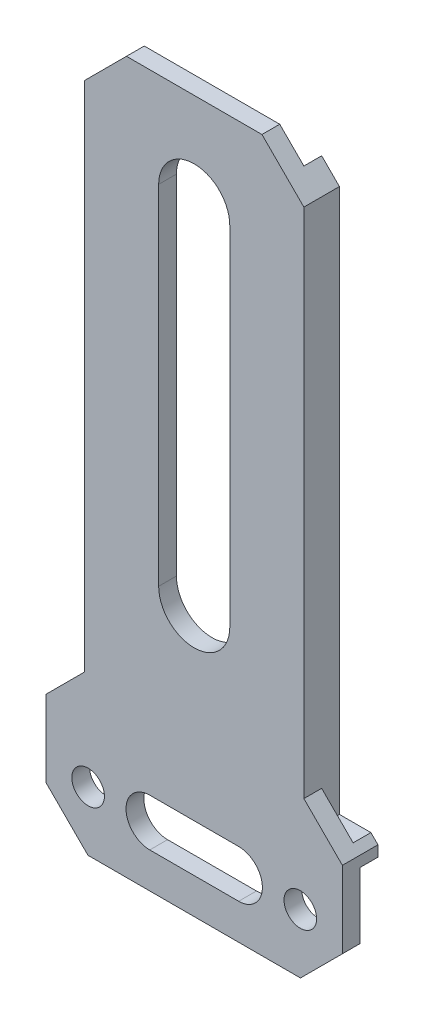
ISO-10303-21;
HEADER;
FILE_DESCRIPTION(('STEP AP214'),'2;1');
FILE_NAME('part.step','',(''),(''),'','','');
FILE_SCHEMA(('AUTOMOTIVE_DESIGN { 1 0 10303 214 1 1 1 1 }'));
ENDSEC;
DATA;
#1=APPLICATION_CONTEXT('core data for automotive mechanical design processes');
#2=APPLICATION_PROTOCOL_DEFINITION('international standard','automotive_design',2000,#1);
#3=PRODUCT_CONTEXT('',#1,'mechanical');
#4=PRODUCT('Part','Part','',(#3));
#5=PRODUCT_RELATED_PRODUCT_CATEGORY('part','',(#4));
#6=PRODUCT_DEFINITION_FORMATION('','',#4);
#7=PRODUCT_DEFINITION_CONTEXT('part definition',#1,'design');
#8=PRODUCT_DEFINITION('design','',#6,#7);
#9=PRODUCT_DEFINITION_SHAPE('','',#8);
#10=(LENGTH_UNIT() NAMED_UNIT(*) SI_UNIT(.MILLI.,.METRE.));
#11=(NAMED_UNIT(*) PLANE_ANGLE_UNIT() SI_UNIT($,.RADIAN.));
#12=(NAMED_UNIT(*) SI_UNIT($,.STERADIAN.) SOLID_ANGLE_UNIT());
#13=UNCERTAINTY_MEASURE_WITH_UNIT(LENGTH_MEASURE(1.E-05),#10,'distance_accuracy_value','');
#14=(GEOMETRIC_REPRESENTATION_CONTEXT(3) GLOBAL_UNCERTAINTY_ASSIGNED_CONTEXT((#13)) GLOBAL_UNIT_ASSIGNED_CONTEXT((#10,
#11,#12)) REPRESENTATION_CONTEXT('',''));
#15=CARTESIAN_POINT('',(0.,0.,0.));
#16=DIRECTION('',(0.,0.,1.));
#17=DIRECTION('',(1.,0.,0.));
#18=AXIS2_PLACEMENT_3D('',#15,#16,#17);
#19=CARTESIAN_POINT('',(0.,0.,0.));
#20=DIRECTION('',(0.,0.,1.));
#21=DIRECTION('',(1.,0.,0.));
#22=AXIS2_PLACEMENT_3D('',#19,#20,#21);
#23=PLANE('',#22);
#24=DIRECTION('',(1.,0.,0.));
#25=VECTOR('',#24,1.);
#26=CARTESIAN_POINT('',(48.81,21.19,0.));
#27=LINE('',#26,#25);
#28=CARTESIAN_POINT('',(43.5,21.19,0.));
#29=VERTEX_POINT('',#28);
#30=CARTESIAN_POINT('',(48.81,21.19,0.));
#31=VERTEX_POINT('',#30);
#32=EDGE_CURVE('E51',#29,#31,#27,.T.);
#33=ORIENTED_EDGE('',*,*,#32,.F.);
#34=DIRECTION('',(0.,-1.,0.));
#35=VECTOR('',#34,1.);
#36=CARTESIAN_POINT('',(43.5,112.928932188135,0.));
#37=LINE('',#36,#35);
#38=CARTESIAN_POINT('',(43.5,26.5,0.));
#39=VERTEX_POINT('',#38);
#40=EDGE_CURVE('E11',#39,#29,#37,.T.);
#41=ORIENTED_EDGE('',*,*,#40,.F.);
#42=DIRECTION('',(-0.707106781186547,0.707106781186548,0.));
#43=VECTOR('',#42,1.);
#44=CARTESIAN_POINT('',(43.5,26.5,0.));
#45=LINE('',#44,#43);
#46=EDGE_CURVE('E380',#31,#39,#45,.T.);
#47=ORIENTED_EDGE('',*,*,#46,.F.);
#48=EDGE_LOOP('',(#33,#41,#47));
#49=FACE_BOUND('',#48,.T.);
#50=ADVANCED_FACE('F35',(#49),#23,.F.);
#51=CARTESIAN_POINT('',(25.,45.27,0.));
#52=DIRECTION('',(0.,0.,1.));
#53=DIRECTION('',(1.,0.,0.));
#54=AXIS2_PLACEMENT_3D('',#51,#52,#53);
#55=CIRCLE('',#54,5.99999999999999);
#56=CARTESIAN_POINT('',(19.,45.27,0.));
#57=VERTEX_POINT('',#56);
#58=CARTESIAN_POINT('',(31.,45.27,0.));
#59=VERTEX_POINT('',#58);
#60=EDGE_CURVE('E305',#57,#59,#55,.T.);
#61=ORIENTED_EDGE('',*,*,#60,.T.);
#62=DIRECTION('',(0.,1.,0.));
#63=VECTOR('',#62,1.);
#64=CARTESIAN_POINT('',(31.,45.27,0.));
#65=LINE('',#64,#63);
#66=CARTESIAN_POINT('',(31.,104.,0.));
#67=VERTEX_POINT('',#66);
#68=EDGE_CURVE('E321',#59,#67,#65,.T.);
#69=ORIENTED_EDGE('',*,*,#68,.T.);
#70=CARTESIAN_POINT('',(25.,104.,0.));
#71=DIRECTION('',(0.,0.,1.));
#72=DIRECTION('',(1.,0.,0.));
#73=AXIS2_PLACEMENT_3D('',#70,#71,#72);
#74=CIRCLE('',#73,6.);
#75=CARTESIAN_POINT('',(19.,104.,0.));
#76=VERTEX_POINT('',#75);
#77=EDGE_CURVE('E324',#67,#76,#74,.T.);
#78=ORIENTED_EDGE('',*,*,#77,.T.);
#79=DIRECTION('',(0.,-1.,0.));
#80=VECTOR('',#79,1.);
#81=CARTESIAN_POINT('',(19.,45.27,0.));
#82=LINE('',#81,#80);
#83=EDGE_CURVE('E311',#76,#57,#82,.T.);
#84=ORIENTED_EDGE('',*,*,#83,.T.);
#85=EDGE_LOOP('',(#61,#69,#78,#84));
#86=FACE_BOUND('',#85,.T.);
#87=DIRECTION('',(0.,1.,0.));
#88=VECTOR('',#87,1.);
#89=CARTESIAN_POINT('',(40.5,115.928932188135,0.));
#90=LINE('',#89,#88);
#91=CARTESIAN_POINT('',(40.5,21.19,0.));
#92=VERTEX_POINT('',#91);
#93=CARTESIAN_POINT('',(40.5,115.928932188135,0.));
#94=VERTEX_POINT('',#93);
#95=EDGE_CURVE('E58',#92,#94,#90,.T.);
#96=ORIENTED_EDGE('',*,*,#95,.F.);
#97=DIRECTION('',(1.,0.,0.));
#98=VECTOR('',#97,1.);
#99=CARTESIAN_POINT('',(40.5,21.19,0.));
#100=LINE('',#99,#98);
#101=CARTESIAN_POINT('',(9.49999999999998,21.19,0.));
#102=VERTEX_POINT('',#101);
#103=EDGE_CURVE('E463',#102,#92,#100,.T.);
#104=ORIENTED_EDGE('',*,*,#103,.F.);
#105=DIRECTION('',(0.,-1.,0.));
#106=VECTOR('',#105,1.);
#107=CARTESIAN_POINT('',(9.49999999999999,115.928932188135,0.));
#108=LINE('',#107,#106);
#109=CARTESIAN_POINT('',(9.49999999999999,115.928932188135,0.));
#110=VERTEX_POINT('',#109);
#111=EDGE_CURVE('E460',#110,#102,#108,.T.);
#112=ORIENTED_EDGE('',*,*,#111,.F.);
#113=DIRECTION('',(-0.707106781186549,-0.707106781186546,0.));
#114=VECTOR('',#113,1.);
#115=CARTESIAN_POINT('',(13.5710678118655,120.,0.));
#116=LINE('',#115,#114);
#117=CARTESIAN_POINT('',(13.5710678118655,120.,0.));
#118=VERTEX_POINT('',#117);
#119=EDGE_CURVE('E338',#118,#110,#116,.T.);
#120=ORIENTED_EDGE('',*,*,#119,.F.);
#121=DIRECTION('',(-1.,0.,0.));
#122=VECTOR('',#121,1.);
#123=CARTESIAN_POINT('',(13.5710678118655,120.,0.));
#124=LINE('',#123,#122);
#125=CARTESIAN_POINT('',(36.4289321881345,120.,0.));
#126=VERTEX_POINT('',#125);
#127=EDGE_CURVE('E343',#126,#118,#124,.T.);
#128=ORIENTED_EDGE('',*,*,#127,.F.);
#129=DIRECTION('',(-0.707106781186549,0.707106781186546,0.));
#130=VECTOR('',#129,1.);
#131=CARTESIAN_POINT('',(36.4289321881345,120.,0.));
#132=LINE('',#131,#130);
#133=EDGE_CURVE('E383',#94,#126,#132,.T.);
#134=ORIENTED_EDGE('',*,*,#133,.F.);
#135=EDGE_LOOP('',(#96,#104,#112,#120,#128,#134));
#136=FACE_BOUND('',#135,.T.);
#137=ADVANCED_FACE('F503',(#86,#136),#23,.F.);
#138=DIRECTION('',(0.,1.,0.));
#139=VECTOR('',#138,1.);
#140=CARTESIAN_POINT('',(6.5,112.928932188135,0.));
#141=LINE('',#140,#139);
#142=CARTESIAN_POINT('',(6.5,21.19,0.));
#143=VERTEX_POINT('',#142);
#144=CARTESIAN_POINT('',(6.5,26.5,0.));
#145=VERTEX_POINT('',#144);
#146=EDGE_CURVE('E457',#143,#145,#141,.T.);
#147=ORIENTED_EDGE('',*,*,#146,.F.);
#148=DIRECTION('',(1.,0.,0.));
#149=VECTOR('',#148,1.);
#150=CARTESIAN_POINT('',(6.5,21.19,0.));
#151=LINE('',#150,#149);
#152=CARTESIAN_POINT('',(1.19,21.19,0.));
#153=VERTEX_POINT('',#152);
#154=EDGE_CURVE('E454',#153,#143,#151,.T.);
#155=ORIENTED_EDGE('',*,*,#154,.F.);
#156=DIRECTION('',(-0.707106781186549,-0.707106781186546,0.));
#157=VECTOR('',#156,1.);
#158=CARTESIAN_POINT('',(6.5,26.5,0.));
#159=LINE('',#158,#157);
#160=EDGE_CURVE('E368',#145,#153,#159,.T.);
#161=ORIENTED_EDGE('',*,*,#160,.F.);
#162=EDGE_LOOP('',(#147,#155,#161));
#163=FACE_BOUND('',#162,.T.);
#164=ADVANCED_FACE('F492',(#163),#23,.F.);
#165=CARTESIAN_POINT('',(17.5,10.,0.));
#166=DIRECTION('',(0.,0.,1.));
#167=DIRECTION('',(1.,0.,0.));
#168=AXIS2_PLACEMENT_3D('',#165,#166,#167);
#169=CIRCLE('',#168,4.);
#170=CARTESIAN_POINT('',(17.5,14.,0.));
#171=VERTEX_POINT('',#170);
#172=CARTESIAN_POINT('',(17.5,6.,0.));
#173=VERTEX_POINT('',#172);
#174=EDGE_CURVE('E259',#171,#173,#169,.T.);
#175=ORIENTED_EDGE('',*,*,#174,.T.);
#176=DIRECTION('',(1.,0.,0.));
#177=VECTOR('',#176,1.);
#178=CARTESIAN_POINT('',(17.5,6.,0.));
#179=LINE('',#178,#177);
#180=CARTESIAN_POINT('',(32.5,6.,0.));
#181=VERTEX_POINT('',#180);
#182=EDGE_CURVE('E262',#173,#181,#179,.T.);
#183=ORIENTED_EDGE('',*,*,#182,.T.);
#184=CARTESIAN_POINT('',(32.5,10.,0.));
#185=DIRECTION('',(0.,0.,1.));
#186=DIRECTION('',(1.,0.,0.));
#187=AXIS2_PLACEMENT_3D('',#184,#185,#186);
#188=CIRCLE('',#187,4.);
#189=CARTESIAN_POINT('',(32.5,14.,0.));
#190=VERTEX_POINT('',#189);
#191=EDGE_CURVE('E281',#181,#190,#188,.T.);
#192=ORIENTED_EDGE('',*,*,#191,.T.);
#193=DIRECTION('',(-1.,0.,0.));
#194=VECTOR('',#193,1.);
#195=CARTESIAN_POINT('',(17.5,14.,0.));
#196=LINE('',#195,#194);
#197=EDGE_CURVE('E271',#190,#171,#196,.T.);
#198=ORIENTED_EDGE('',*,*,#197,.T.);
#199=EDGE_LOOP('',(#175,#183,#192,#198));
#200=FACE_BOUND('',#199,.T.);
#201=CARTESIAN_POINT('',(7.09999999999999,9.99999999999999,0.));
#202=DIRECTION('',(0.,0.,1.));
#203=DIRECTION('',(1.,0.,0.));
#204=AXIS2_PLACEMENT_3D('',#201,#202,#203);
#205=CIRCLE('',#204,2.75);
#206=CARTESIAN_POINT('',(9.84999999999999,9.99999999999999,0.));
#207=VERTEX_POINT('',#206);
#208=EDGE_CURVE('E299',#207,#207,#205,.T.);
#209=ORIENTED_EDGE('',*,*,#208,.T.);
#210=EDGE_LOOP('',(#209));
#211=FACE_BOUND('',#210,.T.);
#212=CARTESIAN_POINT('',(42.9,9.99999999999999,0.));
#213=DIRECTION('',(0.,0.,1.));
#214=DIRECTION('',(-1.,0.,0.));
#215=AXIS2_PLACEMENT_3D('',#212,#213,#214);
#216=CIRCLE('',#215,2.74999999999999);
#217=CARTESIAN_POINT('',(40.15,9.99999999999999,0.));
#218=VERTEX_POINT('',#217);
#219=EDGE_CURVE('E295',#218,#218,#216,.T.);
#220=ORIENTED_EDGE('',*,*,#219,.T.);
#221=EDGE_LOOP('',(#220));
#222=FACE_BOUND('',#221,.T.);
#223=DIRECTION('',(-1.,0.,0.));
#224=VECTOR('',#223,1.);
#225=CARTESIAN_POINT('',(50.,18.19,0.));
#226=LINE('',#225,#224);
#227=CARTESIAN_POINT('',(50.,18.19,0.));
#228=VERTEX_POINT('',#227);
#229=CARTESIAN_POINT('',(0.,18.19,0.));
#230=VERTEX_POINT('',#229);
#231=EDGE_CURVE('E452',#228,#230,#226,.T.);
#232=ORIENTED_EDGE('',*,*,#231,.F.);
#233=DIRECTION('',(0.,1.,0.));
#234=VECTOR('',#233,1.);
#235=CARTESIAN_POINT('',(50.,7.07106781186551,0.));
#236=LINE('',#235,#234);
#237=CARTESIAN_POINT('',(50.,7.07106781186551,0.));
#238=VERTEX_POINT('',#237);
#239=EDGE_CURVE('E258',#238,#228,#236,.T.);
#240=ORIENTED_EDGE('',*,*,#239,.F.);
#241=DIRECTION('',(0.707106781186544,0.707106781186551,0.));
#242=VECTOR('',#241,1.);
#243=CARTESIAN_POINT('',(50.,7.07106781186551,0.));
#244=LINE('',#243,#242);
#245=CARTESIAN_POINT('',(42.9289321881345,0.,0.));
#246=VERTEX_POINT('',#245);
#247=EDGE_CURVE('E377',#246,#238,#244,.T.);
#248=ORIENTED_EDGE('',*,*,#247,.F.);
#249=DIRECTION('',(1.,0.,0.));
#250=VECTOR('',#249,1.);
#251=CARTESIAN_POINT('',(7.07106781186544,0.,0.));
#252=LINE('',#251,#250);
#253=CARTESIAN_POINT('',(7.07106781186544,0.,0.));
#254=VERTEX_POINT('',#253);
#255=EDGE_CURVE('E375',#254,#246,#252,.T.);
#256=ORIENTED_EDGE('',*,*,#255,.F.);
#257=DIRECTION('',(0.707106781186544,-0.707106781186551,0.));
#258=VECTOR('',#257,1.);
#259=CARTESIAN_POINT('',(0.,7.07106781186551,0.));
#260=LINE('',#259,#258);
#261=CARTESIAN_POINT('',(0.,7.07106781186551,0.));
#262=VERTEX_POINT('',#261);
#263=EDGE_CURVE('E373',#262,#254,#260,.T.);
#264=ORIENTED_EDGE('',*,*,#263,.F.);
#265=DIRECTION('',(0.,-1.,0.));
#266=VECTOR('',#265,1.);
#267=CARTESIAN_POINT('',(0.,7.07106781186551,0.));
#268=LINE('',#267,#266);
#269=EDGE_CURVE('E371',#230,#262,#268,.T.);
#270=ORIENTED_EDGE('',*,*,#269,.F.);
#271=EDGE_LOOP('',(#232,#240,#248,#256,#264,#270));
#272=FACE_BOUND('',#271,.T.);
#273=ADVANCED_FACE('F544',(#200,#211,#222,#272),#23,.F.);
#274=CARTESIAN_POINT('',(0.,0.,3.));
#275=DIRECTION('',(0.,0.,1.));
#276=DIRECTION('',(1.,0.,0.));
#277=AXIS2_PLACEMENT_3D('',#274,#275,#276);
#278=PLANE('',#277);
#279=CARTESIAN_POINT('',(7.09999999999999,9.99999999999999,3.));
#280=DIRECTION('',(0.,0.,1.));
#281=DIRECTION('',(1.,0.,0.));
#282=AXIS2_PLACEMENT_3D('',#279,#280,#281);
#283=CIRCLE('',#282,2.75);
#284=CARTESIAN_POINT('',(9.84999999999999,9.99999999999999,3.));
#285=VERTEX_POINT('',#284);
#286=EDGE_CURVE('E302',#285,#285,#283,.T.);
#287=ORIENTED_EDGE('',*,*,#286,.F.);
#288=EDGE_LOOP('',(#287));
#289=FACE_BOUND('',#288,.T.);
#290=DIRECTION('',(-0.707106781186549,-0.707106781186546,0.));
#291=VECTOR('',#290,1.);
#292=CARTESIAN_POINT('',(13.5710678118655,120.,3.));
#293=LINE('',#292,#291);
#294=CARTESIAN_POINT('',(13.5710678118655,120.,3.));
#295=VERTEX_POINT('',#294);
#296=CARTESIAN_POINT('',(6.5,112.928932188135,3.));
#297=VERTEX_POINT('',#296);
#298=EDGE_CURVE('E339',#295,#297,#293,.T.);
#299=ORIENTED_EDGE('',*,*,#298,.T.);
#300=DIRECTION('',(0.,-1.,0.));
#301=VECTOR('',#300,1.);
#302=CARTESIAN_POINT('',(6.5,112.928932188135,3.));
#303=LINE('',#302,#301);
#304=CARTESIAN_POINT('',(6.5,26.5,3.));
#305=VERTEX_POINT('',#304);
#306=EDGE_CURVE('E342',#297,#305,#303,.T.);
#307=ORIENTED_EDGE('',*,*,#306,.T.);
#308=DIRECTION('',(-0.707106781186549,-0.707106781186546,0.));
#309=VECTOR('',#308,1.);
#310=CARTESIAN_POINT('',(6.5,26.5,3.));
#311=LINE('',#310,#309);
#312=CARTESIAN_POINT('',(0.,20.,3.));
#313=VERTEX_POINT('',#312);
#314=EDGE_CURVE('E345',#305,#313,#311,.T.);
#315=ORIENTED_EDGE('',*,*,#314,.T.);
#316=DIRECTION('',(0.,-1.,0.));
#317=VECTOR('',#316,1.);
#318=CARTESIAN_POINT('',(0.,7.07106781186551,3.));
#319=LINE('',#318,#317);
#320=CARTESIAN_POINT('',(0.,7.07106781186551,3.));
#321=VERTEX_POINT('',#320);
#322=EDGE_CURVE('E347',#313,#321,#319,.T.);
#323=ORIENTED_EDGE('',*,*,#322,.T.);
#324=DIRECTION('',(0.707106781186544,-0.707106781186551,0.));
#325=VECTOR('',#324,1.);
#326=CARTESIAN_POINT('',(0.,7.07106781186551,3.));
#327=LINE('',#326,#325);
#328=CARTESIAN_POINT('',(7.07106781186544,0.,3.));
#329=VERTEX_POINT('',#328);
#330=EDGE_CURVE('E349',#321,#329,#327,.T.);
#331=ORIENTED_EDGE('',*,*,#330,.T.);
#332=DIRECTION('',(1.,0.,0.));
#333=VECTOR('',#332,1.);
#334=CARTESIAN_POINT('',(7.07106781186544,0.,3.));
#335=LINE('',#334,#333);
#336=CARTESIAN_POINT('',(42.9289321881345,0.,3.));
#337=VERTEX_POINT('',#336);
#338=EDGE_CURVE('E351',#329,#337,#335,.T.);
#339=ORIENTED_EDGE('',*,*,#338,.T.);
#340=DIRECTION('',(0.707106781186544,0.707106781186551,0.));
#341=VECTOR('',#340,1.);
#342=CARTESIAN_POINT('',(50.,7.07106781186551,3.));
#343=LINE('',#342,#341);
#344=CARTESIAN_POINT('',(50.,7.07106781186551,3.));
#345=VERTEX_POINT('',#344);
#346=EDGE_CURVE('E353',#337,#345,#343,.T.);
#347=ORIENTED_EDGE('',*,*,#346,.T.);
#348=DIRECTION('',(0.,1.,0.));
#349=VECTOR('',#348,1.);
#350=CARTESIAN_POINT('',(50.,7.07106781186551,3.));
#351=LINE('',#350,#349);
#352=CARTESIAN_POINT('',(50.,20.,3.));
#353=VERTEX_POINT('',#352);
#354=EDGE_CURVE('E355',#345,#353,#351,.T.);
#355=ORIENTED_EDGE('',*,*,#354,.T.);
#356=DIRECTION('',(-0.707106781186547,0.707106781186548,0.));
#357=VECTOR('',#356,1.);
#358=CARTESIAN_POINT('',(43.5,26.5,3.));
#359=LINE('',#358,#357);
#360=CARTESIAN_POINT('',(43.5,26.5,3.));
#361=VERTEX_POINT('',#360);
#362=EDGE_CURVE('E357',#353,#361,#359,.T.);
#363=ORIENTED_EDGE('',*,*,#362,.T.);
#364=DIRECTION('',(0.,1.,0.));
#365=VECTOR('',#364,1.);
#366=CARTESIAN_POINT('',(43.5,112.928932188135,3.));
#367=LINE('',#366,#365);
#368=CARTESIAN_POINT('',(43.5,112.928932188135,3.));
#369=VERTEX_POINT('',#368);
#370=EDGE_CURVE('E359',#361,#369,#367,.T.);
#371=ORIENTED_EDGE('',*,*,#370,.T.);
#372=DIRECTION('',(-0.707106781186549,0.707106781186546,0.));
#373=VECTOR('',#372,1.);
#374=CARTESIAN_POINT('',(36.4289321881345,120.,3.));
#375=LINE('',#374,#373);
#376=CARTESIAN_POINT('',(36.4289321881345,120.,3.));
#377=VERTEX_POINT('',#376);
#378=EDGE_CURVE('E361',#369,#377,#375,.T.);
#379=ORIENTED_EDGE('',*,*,#378,.T.);
#380=DIRECTION('',(-1.,0.,0.));
#381=VECTOR('',#380,1.);
#382=CARTESIAN_POINT('',(13.5710678118655,120.,3.));
#383=LINE('',#382,#381);
#384=EDGE_CURVE('E363',#377,#295,#383,.T.);
#385=ORIENTED_EDGE('',*,*,#384,.T.);
#386=EDGE_LOOP('',(#299,#307,#315,#323,#331,#339,#347,#355,#363,#371,#379,#385));
#387=FACE_BOUND('',#386,.T.);
#388=DIRECTION('',(0.,1.,0.));
#389=VECTOR('',#388,1.);
#390=CARTESIAN_POINT('',(31.,45.27,3.));
#391=LINE('',#390,#389);
#392=CARTESIAN_POINT('',(31.,45.27,3.));
#393=VERTEX_POINT('',#392);
#394=CARTESIAN_POINT('',(31.,104.,3.));
#395=VERTEX_POINT('',#394);
#396=EDGE_CURVE('E310',#393,#395,#391,.T.);
#397=ORIENTED_EDGE('',*,*,#396,.F.);
#398=CARTESIAN_POINT('',(25.,45.27,3.));
#399=DIRECTION('',(0.,0.,1.));
#400=DIRECTION('',(1.,0.,0.));
#401=AXIS2_PLACEMENT_3D('',#398,#399,#400);
#402=CIRCLE('',#401,5.99999999999999);
#403=CARTESIAN_POINT('',(19.,45.27,3.));
#404=VERTEX_POINT('',#403);
#405=EDGE_CURVE('E308',#404,#393,#402,.T.);
#406=ORIENTED_EDGE('',*,*,#405,.F.);
#407=DIRECTION('',(0.,-1.,0.));
#408=VECTOR('',#407,1.);
#409=CARTESIAN_POINT('',(19.,45.27,3.));
#410=LINE('',#409,#408);
#411=CARTESIAN_POINT('',(19.,104.,3.));
#412=VERTEX_POINT('',#411);
#413=EDGE_CURVE('E316',#412,#404,#410,.T.);
#414=ORIENTED_EDGE('',*,*,#413,.F.);
#415=CARTESIAN_POINT('',(25.,104.,3.));
#416=DIRECTION('',(0.,0.,1.));
#417=DIRECTION('',(1.,0.,0.));
#418=AXIS2_PLACEMENT_3D('',#415,#416,#417);
#419=CIRCLE('',#418,6.);
#420=EDGE_CURVE('E313',#395,#412,#419,.T.);
#421=ORIENTED_EDGE('',*,*,#420,.F.);
#422=EDGE_LOOP('',(#397,#406,#414,#421));
#423=FACE_BOUND('',#422,.T.);
#424=CARTESIAN_POINT('',(42.9,9.99999999999999,3.));
#425=DIRECTION('',(0.,0.,1.));
#426=DIRECTION('',(-1.,0.,0.));
#427=AXIS2_PLACEMENT_3D('',#424,#425,#426);
#428=CIRCLE('',#427,2.74999999999999);
#429=CARTESIAN_POINT('',(40.15,9.99999999999999,3.));
#430=VERTEX_POINT('',#429);
#431=EDGE_CURVE('E296',#430,#430,#428,.T.);
#432=ORIENTED_EDGE('',*,*,#431,.F.);
#433=EDGE_LOOP('',(#432));
#434=FACE_BOUND('',#433,.T.);
#435=DIRECTION('',(1.,0.,0.));
#436=VECTOR('',#435,1.);
#437=CARTESIAN_POINT('',(17.5,6.,3.));
#438=LINE('',#437,#436);
#439=CARTESIAN_POINT('',(17.5,6.,3.));
#440=VERTEX_POINT('',#439);
#441=CARTESIAN_POINT('',(32.5,6.,3.));
#442=VERTEX_POINT('',#441);
#443=EDGE_CURVE('E270',#440,#442,#438,.T.);
#444=ORIENTED_EDGE('',*,*,#443,.F.);
#445=CARTESIAN_POINT('',(17.5,10.,3.));
#446=DIRECTION('',(0.,0.,1.));
#447=DIRECTION('',(1.,0.,0.));
#448=AXIS2_PLACEMENT_3D('',#445,#446,#447);
#449=CIRCLE('',#448,4.);
#450=CARTESIAN_POINT('',(17.5,14.,3.));
#451=VERTEX_POINT('',#450);
#452=EDGE_CURVE('E268',#451,#440,#449,.T.);
#453=ORIENTED_EDGE('',*,*,#452,.F.);
#454=DIRECTION('',(-1.,0.,0.));
#455=VECTOR('',#454,1.);
#456=CARTESIAN_POINT('',(17.5,14.,3.));
#457=LINE('',#456,#455);
#458=CARTESIAN_POINT('',(32.5,14.,3.));
#459=VERTEX_POINT('',#458);
#460=EDGE_CURVE('E276',#459,#451,#457,.T.);
#461=ORIENTED_EDGE('',*,*,#460,.F.);
#462=CARTESIAN_POINT('',(32.5,10.,3.));
#463=DIRECTION('',(0.,0.,1.));
#464=DIRECTION('',(1.,0.,0.));
#465=AXIS2_PLACEMENT_3D('',#462,#463,#464);
#466=CIRCLE('',#465,4.);
#467=EDGE_CURVE('E273',#442,#459,#466,.T.);
#468=ORIENTED_EDGE('',*,*,#467,.F.);
#469=EDGE_LOOP('',(#444,#453,#461,#468));
#470=FACE_BOUND('',#469,.T.);
#471=ADVANCED_FACE('F495',(#289,#387,#423,#434,#470),#278,.T.);
#472=CARTESIAN_POINT('',(13.5710678118655,120.,3.));
#473=DIRECTION('',(0.707106781186546,-0.707106781186548,0.));
#474=DIRECTION('',(0.707106781186549,0.707106781186546,0.));
#475=AXIS2_PLACEMENT_3D('',#472,#473,#474);
#476=PLANE('',#475);
#477=ORIENTED_EDGE('',*,*,#119,.T.);
#478=DIRECTION('',(0.,0.,1.));
#479=VECTOR('',#478,1.);
#480=CARTESIAN_POINT('',(9.49999999999999,115.928932188135,-3.));
#481=LINE('',#480,#479);
#482=CARTESIAN_POINT('',(9.49999999999999,115.928932188135,-3.));
#483=VERTEX_POINT('',#482);
#484=EDGE_CURVE('E432',#483,#110,#481,.T.);
#485=ORIENTED_EDGE('',*,*,#484,.F.);
#486=DIRECTION('',(0.70710678118655,0.707106781186545,0.));
#487=VECTOR('',#486,1.);
#488=CARTESIAN_POINT('',(6.5,112.928932188135,-3.));
#489=LINE('',#488,#487);
#490=CARTESIAN_POINT('',(6.5,112.928932188135,-3.));
#491=VERTEX_POINT('',#490);
#492=EDGE_CURVE('E425',#491,#483,#489,.T.);
#493=ORIENTED_EDGE('',*,*,#492,.F.);
#494=DIRECTION('',(0.,0.,-1.));
#495=VECTOR('',#494,1.);
#496=CARTESIAN_POINT('',(6.5,112.928932188135,3.));
#497=LINE('',#496,#495);
#498=EDGE_CURVE('E39',#297,#491,#497,.T.);
#499=ORIENTED_EDGE('',*,*,#498,.F.);
#500=ORIENTED_EDGE('',*,*,#298,.F.);
#501=DIRECTION('',(0.,0.,-1.));
#502=VECTOR('',#501,1.);
#503=CARTESIAN_POINT('',(13.5710678118655,120.,3.));
#504=LINE('',#503,#502);
#505=EDGE_CURVE('E365',#295,#118,#504,.T.);
#506=ORIENTED_EDGE('',*,*,#505,.T.);
#507=EDGE_LOOP('',(#477,#485,#493,#499,#500,#506));
#508=FACE_BOUND('',#507,.T.);
#509=ADVANCED_FACE('F37',(#508),#476,.F.);
#510=CARTESIAN_POINT('',(6.5,112.928932188135,3.));
#511=DIRECTION('',(1.,0.,0.));
#512=DIRECTION('',(0.,1.,0.));
#513=AXIS2_PLACEMENT_3D('',#510,#511,#512);
#514=PLANE('',#513);
#515=ORIENTED_EDGE('',*,*,#498,.T.);
#516=DIRECTION('',(0.,1.,0.));
#517=VECTOR('',#516,1.);
#518=CARTESIAN_POINT('',(6.5,112.928932188135,-3.));
#519=LINE('',#518,#517);
#520=CARTESIAN_POINT('',(6.5,21.19,-3.));
#521=VERTEX_POINT('',#520);
#522=EDGE_CURVE('E421',#521,#491,#519,.T.);
#523=ORIENTED_EDGE('',*,*,#522,.F.);
#524=DIRECTION('',(0.,0.,1.));
#525=VECTOR('',#524,1.);
#526=CARTESIAN_POINT('',(6.5,21.19,-3.));
#527=LINE('',#526,#525);
#528=EDGE_CURVE('E482',#521,#143,#527,.T.);
#529=ORIENTED_EDGE('',*,*,#528,.T.);
#530=ORIENTED_EDGE('',*,*,#146,.T.);
#531=DIRECTION('',(0.,0.,-1.));
#532=VECTOR('',#531,1.);
#533=CARTESIAN_POINT('',(6.5,26.5,3.));
#534=LINE('',#533,#532);
#535=EDGE_CURVE('E410',#305,#145,#534,.T.);
#536=ORIENTED_EDGE('',*,*,#535,.F.);
#537=ORIENTED_EDGE('',*,*,#306,.F.);
#538=EDGE_LOOP('',(#515,#523,#529,#530,#536,#537));
#539=FACE_BOUND('',#538,.T.);
#540=ADVANCED_FACE('F419',(#539),#514,.F.);
#541=CARTESIAN_POINT('',(6.5,26.5,3.));
#542=DIRECTION('',(0.707106781186546,-0.707106781186548,0.));
#543=DIRECTION('',(0.707106781186549,0.707106781186546,0.));
#544=AXIS2_PLACEMENT_3D('',#541,#542,#543);
#545=PLANE('',#544);
#546=ORIENTED_EDGE('',*,*,#160,.T.);
#547=DIRECTION('',(0.,0.,1.));
#548=VECTOR('',#547,1.);
#549=CARTESIAN_POINT('',(1.19000000000003,21.19,-3.));
#550=LINE('',#549,#548);
#551=CARTESIAN_POINT('',(1.19000000000003,21.19,-3.));
#552=VERTEX_POINT('',#551);
#553=EDGE_CURVE('E264',#552,#153,#550,.T.);
#554=ORIENTED_EDGE('',*,*,#553,.F.);
#555=DIRECTION('',(0.707106781186558,0.707106781186537,0.));
#556=VECTOR('',#555,1.);
#557=CARTESIAN_POINT('',(1.19000000000003,21.19,-3.));
#558=LINE('',#557,#556);
#559=CARTESIAN_POINT('',(0.,20.,-3.));
#560=VERTEX_POINT('',#559);
#561=EDGE_CURVE('E490',#560,#552,#558,.T.);
#562=ORIENTED_EDGE('',*,*,#561,.F.);
#563=DIRECTION('',(0.,0.,-1.));
#564=VECTOR('',#563,1.);
#565=CARTESIAN_POINT('',(0.,20.,3.));
#566=LINE('',#565,#564);
#567=EDGE_CURVE('E409',#313,#560,#566,.T.);
#568=ORIENTED_EDGE('',*,*,#567,.F.);
#569=ORIENTED_EDGE('',*,*,#314,.F.);
#570=ORIENTED_EDGE('',*,*,#535,.T.);
#571=EDGE_LOOP('',(#546,#554,#562,#568,#569,#570));
#572=FACE_BOUND('',#571,.T.);
#573=ADVANCED_FACE('F488',(#572),#545,.F.);
#574=CARTESIAN_POINT('',(0.,7.07106781186551,3.));
#575=DIRECTION('',(1.,0.,0.));
#576=DIRECTION('',(0.,0.,-1.));
#577=AXIS2_PLACEMENT_3D('',#574,#575,#576);
#578=PLANE('',#577);
#579=ORIENTED_EDGE('',*,*,#567,.T.);
#580=DIRECTION('',(0.,1.,0.));
#581=VECTOR('',#580,1.);
#582=CARTESIAN_POINT('',(0.,20.,-3.));
#583=LINE('',#582,#581);
#584=CARTESIAN_POINT('',(0.,18.19,-3.));
#585=VERTEX_POINT('',#584);
#586=EDGE_CURVE('E243',#585,#560,#583,.T.);
#587=ORIENTED_EDGE('',*,*,#586,.F.);
#588=DIRECTION('',(0.,0.,1.));
#589=VECTOR('',#588,1.);
#590=CARTESIAN_POINT('',(0.,18.19,-3.));
#591=LINE('',#590,#589);
#592=EDGE_CURVE('E239',#585,#230,#591,.T.);
#593=ORIENTED_EDGE('',*,*,#592,.T.);
#594=ORIENTED_EDGE('',*,*,#269,.T.);
#595=DIRECTION('',(0.,0.,-1.));
#596=VECTOR('',#595,1.);
#597=CARTESIAN_POINT('',(0.,7.07106781186551,3.));
#598=LINE('',#597,#596);
#599=EDGE_CURVE('E406',#321,#262,#598,.T.);
#600=ORIENTED_EDGE('',*,*,#599,.F.);
#601=ORIENTED_EDGE('',*,*,#322,.F.);
#602=EDGE_LOOP('',(#579,#587,#593,#594,#600,#601));
#603=FACE_BOUND('',#602,.T.);
#604=ADVANCED_FACE('F547',(#603),#578,.F.);
#605=CARTESIAN_POINT('',(0.,7.07106781186551,3.));
#606=DIRECTION('',(0.707106781186551,0.707106781186544,0.));
#607=DIRECTION('',(-0.707106781186544,0.707106781186551,0.));
#608=AXIS2_PLACEMENT_3D('',#605,#606,#607);
#609=PLANE('',#608);
#610=ORIENTED_EDGE('',*,*,#263,.T.);
#611=DIRECTION('',(0.,0.,-1.));
#612=VECTOR('',#611,1.);
#613=CARTESIAN_POINT('',(7.07106781186544,0.,3.));
#614=LINE('',#613,#612);
#615=EDGE_CURVE('E403',#329,#254,#614,.T.);
#616=ORIENTED_EDGE('',*,*,#615,.F.);
#617=ORIENTED_EDGE('',*,*,#330,.F.);
#618=ORIENTED_EDGE('',*,*,#599,.T.);
#619=EDGE_LOOP('',(#610,#616,#617,#618));
#620=FACE_BOUND('',#619,.T.);
#621=ADVANCED_FACE('F553',(#620),#609,.F.);
#622=CARTESIAN_POINT('',(7.07106781186544,0.,3.));
#623=DIRECTION('',(0.,1.,0.));
#624=DIRECTION('',(0.,0.,1.));
#625=AXIS2_PLACEMENT_3D('',#622,#623,#624);
#626=PLANE('',#625);
#627=ORIENTED_EDGE('',*,*,#255,.T.);
#628=DIRECTION('',(0.,0.,-1.));
#629=VECTOR('',#628,1.);
#630=CARTESIAN_POINT('',(42.9289321881345,0.,3.));
#631=LINE('',#630,#629);
#632=EDGE_CURVE('E400',#337,#246,#631,.T.);
#633=ORIENTED_EDGE('',*,*,#632,.F.);
#634=ORIENTED_EDGE('',*,*,#338,.F.);
#635=ORIENTED_EDGE('',*,*,#615,.T.);
#636=EDGE_LOOP('',(#627,#633,#634,#635));
#637=FACE_BOUND('',#636,.T.);
#638=ADVANCED_FACE('F555',(#637),#626,.F.);
#639=CARTESIAN_POINT('',(50.,7.07106781186551,3.));
#640=DIRECTION('',(-0.707106781186551,0.707106781186544,0.));
#641=DIRECTION('',(-0.707106781186544,-0.707106781186551,0.));
#642=AXIS2_PLACEMENT_3D('',#639,#640,#641);
#643=PLANE('',#642);
#644=ORIENTED_EDGE('',*,*,#247,.T.);
#645=DIRECTION('',(0.,0.,-1.));
#646=VECTOR('',#645,1.);
#647=CARTESIAN_POINT('',(50.,7.07106781186551,3.));
#648=LINE('',#647,#646);
#649=EDGE_CURVE('E398',#345,#238,#648,.T.);
#650=ORIENTED_EDGE('',*,*,#649,.F.);
#651=ORIENTED_EDGE('',*,*,#346,.F.);
#652=ORIENTED_EDGE('',*,*,#632,.T.);
#653=EDGE_LOOP('',(#644,#650,#651,#652));
#654=FACE_BOUND('',#653,.T.);
#655=ADVANCED_FACE('F540',(#654),#643,.F.);
#656=CARTESIAN_POINT('',(50.,7.07106781186551,3.));
#657=DIRECTION('',(-1.,0.,0.));
#658=DIRECTION('',(0.,0.,1.));
#659=AXIS2_PLACEMENT_3D('',#656,#657,#658);
#660=PLANE('',#659);
#661=ORIENTED_EDGE('',*,*,#239,.T.);
#662=DIRECTION('',(0.,0.,1.));
#663=VECTOR('',#662,1.);
#664=CARTESIAN_POINT('',(50.,18.19,-3.));
#665=LINE('',#664,#663);
#666=CARTESIAN_POINT('',(50.,18.19,-3.));
#667=VERTEX_POINT('',#666);
#668=EDGE_CURVE('E237',#667,#228,#665,.T.);
#669=ORIENTED_EDGE('',*,*,#668,.F.);
#670=DIRECTION('',(0.,-1.,0.));
#671=VECTOR('',#670,1.);
#672=CARTESIAN_POINT('',(50.,20.,-3.));
#673=LINE('',#672,#671);
#674=CARTESIAN_POINT('',(50.,20.,-3.));
#675=VERTEX_POINT('',#674);
#676=EDGE_CURVE('E244',#675,#667,#673,.T.);
#677=ORIENTED_EDGE('',*,*,#676,.F.);
#678=DIRECTION('',(0.,0.,-1.));
#679=VECTOR('',#678,1.);
#680=CARTESIAN_POINT('',(50.,20.,3.));
#681=LINE('',#680,#679);
#682=EDGE_CURVE('E396',#353,#675,#681,.T.);
#683=ORIENTED_EDGE('',*,*,#682,.F.);
#684=ORIENTED_EDGE('',*,*,#354,.F.);
#685=ORIENTED_EDGE('',*,*,#649,.T.);
#686=EDGE_LOOP('',(#661,#669,#677,#683,#684,#685));
#687=FACE_BOUND('',#686,.T.);
#688=ADVANCED_FACE('F255',(#687),#660,.F.);
#689=CARTESIAN_POINT('',(43.5,26.5,3.));
#690=DIRECTION('',(-0.707106781186548,-0.707106781186547,0.));
#691=DIRECTION('',(0.707106781186547,-0.707106781186548,0.));
#692=AXIS2_PLACEMENT_3D('',#689,#690,#691);
#693=PLANE('',#692);
#694=ORIENTED_EDGE('',*,*,#682,.T.);
#695=DIRECTION('',(0.707106781186548,-0.707106781186546,0.));
#696=VECTOR('',#695,1.);
#697=CARTESIAN_POINT('',(48.81,21.19,-3.));
#698=LINE('',#697,#696);
#699=CARTESIAN_POINT('',(48.81,21.19,-3.));
#700=VERTEX_POINT('',#699);
#701=EDGE_CURVE('E250',#700,#675,#698,.T.);
#702=ORIENTED_EDGE('',*,*,#701,.F.);
#703=DIRECTION('',(0.,0.,1.));
#704=VECTOR('',#703,1.);
#705=CARTESIAN_POINT('',(48.81,21.19,-3.));
#706=LINE('',#705,#704);
#707=EDGE_CURVE('E451',#700,#31,#706,.T.);
#708=ORIENTED_EDGE('',*,*,#707,.T.);
#709=ORIENTED_EDGE('',*,*,#46,.T.);
#710=DIRECTION('',(0.,0.,-1.));
#711=VECTOR('',#710,1.);
#712=CARTESIAN_POINT('',(43.5,26.5,3.));
#713=LINE('',#712,#711);
#714=EDGE_CURVE('E393',#361,#39,#713,.T.);
#715=ORIENTED_EDGE('',*,*,#714,.F.);
#716=ORIENTED_EDGE('',*,*,#362,.F.);
#717=EDGE_LOOP('',(#694,#702,#708,#709,#715,#716));
#718=FACE_BOUND('',#717,.T.);
#719=ADVANCED_FACE('F531',(#718),#693,.F.);
#720=CARTESIAN_POINT('',(43.5,112.928932188135,3.));
#721=DIRECTION('',(-1.,0.,0.));
#722=DIRECTION('',(0.,0.,1.));
#723=AXIS2_PLACEMENT_3D('',#720,#721,#722);
#724=PLANE('',#723);
#725=ORIENTED_EDGE('',*,*,#714,.T.);
#726=ORIENTED_EDGE('',*,*,#40,.T.);
#727=DIRECTION('',(0.,0.,1.));
#728=VECTOR('',#727,1.);
#729=CARTESIAN_POINT('',(43.5,21.19,-3.));
#730=LINE('',#729,#728);
#731=CARTESIAN_POINT('',(43.5,21.19,-3.));
#732=VERTEX_POINT('',#731);
#733=EDGE_CURVE('E469',#732,#29,#730,.T.);
#734=ORIENTED_EDGE('',*,*,#733,.F.);
#735=DIRECTION('',(0.,-1.,0.));
#736=VECTOR('',#735,1.);
#737=CARTESIAN_POINT('',(43.5,112.928932188135,-3.));
#738=LINE('',#737,#736);
#739=CARTESIAN_POINT('',(43.5,112.928932188135,-3.));
#740=VERTEX_POINT('',#739);
#741=EDGE_CURVE('E446',#740,#732,#738,.T.);
#742=ORIENTED_EDGE('',*,*,#741,.F.);
#743=DIRECTION('',(0.,0.,-1.));
#744=VECTOR('',#743,1.);
#745=CARTESIAN_POINT('',(43.5,112.928932188135,3.));
#746=LINE('',#745,#744);
#747=EDGE_CURVE('E391',#369,#740,#746,.T.);
#748=ORIENTED_EDGE('',*,*,#747,.F.);
#749=ORIENTED_EDGE('',*,*,#370,.F.);
#750=EDGE_LOOP('',(#725,#726,#734,#742,#748,#749));
#751=FACE_BOUND('',#750,.T.);
#752=ADVANCED_FACE('F524',(#751),#724,.F.);
#753=CARTESIAN_POINT('',(36.4289321881345,120.,3.));
#754=DIRECTION('',(-0.707106781186546,-0.707106781186549,0.));
#755=DIRECTION('',(0.707106781186549,-0.707106781186546,0.));
#756=AXIS2_PLACEMENT_3D('',#753,#754,#755);
#757=PLANE('',#756);
#758=ORIENTED_EDGE('',*,*,#747,.T.);
#759=DIRECTION('',(0.707106781186547,-0.707106781186547,0.));
#760=VECTOR('',#759,1.);
#761=CARTESIAN_POINT('',(40.5,115.928932188135,-3.));
#762=LINE('',#761,#760);
#763=CARTESIAN_POINT('',(40.5,115.928932188135,-3.));
#764=VERTEX_POINT('',#763);
#765=EDGE_CURVE('E443',#764,#740,#762,.T.);
#766=ORIENTED_EDGE('',*,*,#765,.F.);
#767=DIRECTION('',(0.,0.,1.));
#768=VECTOR('',#767,1.);
#769=CARTESIAN_POINT('',(40.5,115.928932188135,-3.));
#770=LINE('',#769,#768);
#771=EDGE_CURVE('E472',#764,#94,#770,.T.);
#772=ORIENTED_EDGE('',*,*,#771,.T.);
#773=ORIENTED_EDGE('',*,*,#133,.T.);
#774=DIRECTION('',(0.,0.,-1.));
#775=VECTOR('',#774,1.);
#776=CARTESIAN_POINT('',(36.4289321881345,120.,3.));
#777=LINE('',#776,#775);
#778=EDGE_CURVE('E388',#377,#126,#777,.T.);
#779=ORIENTED_EDGE('',*,*,#778,.F.);
#780=ORIENTED_EDGE('',*,*,#378,.F.);
#781=EDGE_LOOP('',(#758,#766,#772,#773,#779,#780));
#782=FACE_BOUND('',#781,.T.);
#783=ADVANCED_FACE('F518',(#782),#757,.F.);
#784=CARTESIAN_POINT('',(13.5710678118655,120.,3.));
#785=DIRECTION('',(0.,-1.,0.));
#786=DIRECTION('',(0.,0.,-1.));
#787=AXIS2_PLACEMENT_3D('',#784,#785,#786);
#788=PLANE('',#787);
#789=ORIENTED_EDGE('',*,*,#127,.T.);
#790=ORIENTED_EDGE('',*,*,#505,.F.);
#791=ORIENTED_EDGE('',*,*,#384,.F.);
#792=ORIENTED_EDGE('',*,*,#778,.T.);
#793=EDGE_LOOP('',(#789,#790,#791,#792));
#794=FACE_BOUND('',#793,.T.);
#795=ADVANCED_FACE('F615',(#794),#788,.F.);
#796=CARTESIAN_POINT('',(25.,45.27,3.));
#797=DIRECTION('',(0.,0.,-1.));
#798=DIRECTION('',(-1.,0.,0.));
#799=AXIS2_PLACEMENT_3D('',#796,#797,#798);
#800=CYLINDRICAL_SURFACE('',#799,5.99999999999999);
#801=ORIENTED_EDGE('',*,*,#60,.F.);
#802=DIRECTION('',(0.,0.,-1.));
#803=VECTOR('',#802,1.);
#804=CARTESIAN_POINT('',(19.,45.27,3.));
#805=LINE('',#804,#803);
#806=EDGE_CURVE('E318',#404,#57,#805,.T.);
#807=ORIENTED_EDGE('',*,*,#806,.F.);
#808=ORIENTED_EDGE('',*,*,#405,.T.);
#809=DIRECTION('',(0.,0.,-1.));
#810=VECTOR('',#809,1.);
#811=CARTESIAN_POINT('',(31.,45.27,3.));
#812=LINE('',#811,#810);
#813=EDGE_CURVE('E335',#393,#59,#812,.T.);
#814=ORIENTED_EDGE('',*,*,#813,.T.);
#815=EDGE_LOOP('',(#801,#807,#808,#814));
#816=FACE_BOUND('',#815,.T.);
#817=ADVANCED_FACE('F612',(#816),#800,.F.);
#818=CARTESIAN_POINT('',(31.,45.27,3.));
#819=DIRECTION('',(-1.,0.,0.));
#820=DIRECTION('',(0.,-1.,0.));
#821=AXIS2_PLACEMENT_3D('',#818,#819,#820);
#822=PLANE('',#821);
#823=ORIENTED_EDGE('',*,*,#68,.F.);
#824=ORIENTED_EDGE('',*,*,#813,.F.);
#825=ORIENTED_EDGE('',*,*,#396,.T.);
#826=DIRECTION('',(0.,0.,-1.));
#827=VECTOR('',#826,1.);
#828=CARTESIAN_POINT('',(31.,104.,3.));
#829=LINE('',#828,#827);
#830=EDGE_CURVE('E333',#395,#67,#829,.T.);
#831=ORIENTED_EDGE('',*,*,#830,.T.);
#832=EDGE_LOOP('',(#823,#824,#825,#831));
#833=FACE_BOUND('',#832,.T.);
#834=ADVANCED_FACE('F608',(#833),#822,.T.);
#835=CARTESIAN_POINT('',(25.,104.,3.));
#836=DIRECTION('',(0.,0.,-1.));
#837=DIRECTION('',(-1.,0.,0.));
#838=AXIS2_PLACEMENT_3D('',#835,#836,#837);
#839=CYLINDRICAL_SURFACE('',#838,6.);
#840=ORIENTED_EDGE('',*,*,#77,.F.);
#841=ORIENTED_EDGE('',*,*,#830,.F.);
#842=ORIENTED_EDGE('',*,*,#420,.T.);
#843=DIRECTION('',(0.,0.,-1.));
#844=VECTOR('',#843,1.);
#845=CARTESIAN_POINT('',(19.,104.,3.));
#846=LINE('',#845,#844);
#847=EDGE_CURVE('E331',#412,#76,#846,.T.);
#848=ORIENTED_EDGE('',*,*,#847,.T.);
#849=EDGE_LOOP('',(#840,#841,#842,#848));
#850=FACE_BOUND('',#849,.T.);
#851=ADVANCED_FACE('F604',(#850),#839,.F.);
#852=CARTESIAN_POINT('',(19.,45.27,3.));
#853=DIRECTION('',(1.,0.,0.));
#854=DIRECTION('',(0.,1.,0.));
#855=AXIS2_PLACEMENT_3D('',#852,#853,#854);
#856=PLANE('',#855);
#857=ORIENTED_EDGE('',*,*,#83,.F.);
#858=ORIENTED_EDGE('',*,*,#847,.F.);
#859=ORIENTED_EDGE('',*,*,#413,.T.);
#860=ORIENTED_EDGE('',*,*,#806,.T.);
#861=EDGE_LOOP('',(#857,#858,#859,#860));
#862=FACE_BOUND('',#861,.T.);
#863=ADVANCED_FACE('F597',(#862),#856,.T.);
#864=CARTESIAN_POINT('',(7.09999999999999,9.99999999999999,3.));
#865=DIRECTION('',(0.,0.,-1.));
#866=DIRECTION('',(-1.,0.,0.));
#867=AXIS2_PLACEMENT_3D('',#864,#865,#866);
#868=CYLINDRICAL_SURFACE('',#867,2.75);
#869=ORIENTED_EDGE('',*,*,#286,.T.);
#870=EDGE_LOOP('',(#869));
#871=FACE_BOUND('',#870,.T.);
#872=ORIENTED_EDGE('',*,*,#208,.F.);
#873=EDGE_LOOP('',(#872));
#874=FACE_BOUND('',#873,.T.);
#875=ADVANCED_FACE('F587',(#871,#874),#868,.F.);
#876=CARTESIAN_POINT('',(42.9,9.99999999999999,3.));
#877=DIRECTION('',(0.,0.,-1.));
#878=DIRECTION('',(-1.,0.,0.));
#879=AXIS2_PLACEMENT_3D('',#876,#877,#878);
#880=CYLINDRICAL_SURFACE('',#879,2.74999999999999);
#881=ORIENTED_EDGE('',*,*,#431,.T.);
#882=EDGE_LOOP('',(#881));
#883=FACE_BOUND('',#882,.T.);
#884=ORIENTED_EDGE('',*,*,#219,.F.);
#885=EDGE_LOOP('',(#884));
#886=FACE_BOUND('',#885,.T.);
#887=ADVANCED_FACE('F584',(#883,#886),#880,.F.);
#888=CARTESIAN_POINT('',(17.5,10.,3.));
#889=DIRECTION('',(0.,0.,-1.));
#890=DIRECTION('',(-1.,0.,0.));
#891=AXIS2_PLACEMENT_3D('',#888,#889,#890);
#892=CYLINDRICAL_SURFACE('',#891,4.);
#893=ORIENTED_EDGE('',*,*,#174,.F.);
#894=DIRECTION('',(0.,0.,-1.));
#895=VECTOR('',#894,1.);
#896=CARTESIAN_POINT('',(17.5,14.,3.));
#897=LINE('',#896,#895);
#898=EDGE_CURVE('E277',#451,#171,#897,.T.);
#899=ORIENTED_EDGE('',*,*,#898,.F.);
#900=ORIENTED_EDGE('',*,*,#452,.T.);
#901=DIRECTION('',(0.,0.,-1.));
#902=VECTOR('',#901,1.);
#903=CARTESIAN_POINT('',(17.5,6.,3.));
#904=LINE('',#903,#902);
#905=EDGE_CURVE('E292',#440,#173,#904,.T.);
#906=ORIENTED_EDGE('',*,*,#905,.T.);
#907=EDGE_LOOP('',(#893,#899,#900,#906));
#908=FACE_BOUND('',#907,.T.);
#909=ADVANCED_FACE('F586',(#908),#892,.F.);
#910=CARTESIAN_POINT('',(17.5,6.,3.));
#911=DIRECTION('',(0.,1.,0.));
#912=DIRECTION('',(-1.,0.,0.));
#913=AXIS2_PLACEMENT_3D('',#910,#911,#912);
#914=PLANE('',#913);
#915=ORIENTED_EDGE('',*,*,#182,.F.);
#916=ORIENTED_EDGE('',*,*,#905,.F.);
#917=ORIENTED_EDGE('',*,*,#443,.T.);
#918=DIRECTION('',(0.,0.,-1.));
#919=VECTOR('',#918,1.);
#920=CARTESIAN_POINT('',(32.5,6.,3.));
#921=LINE('',#920,#919);
#922=EDGE_CURVE('E290',#442,#181,#921,.T.);
#923=ORIENTED_EDGE('',*,*,#922,.T.);
#924=EDGE_LOOP('',(#915,#916,#917,#923));
#925=FACE_BOUND('',#924,.T.);
#926=ADVANCED_FACE('F594',(#925),#914,.T.);
#927=CARTESIAN_POINT('',(32.5,10.,3.));
#928=DIRECTION('',(0.,0.,-1.));
#929=DIRECTION('',(-1.,0.,0.));
#930=AXIS2_PLACEMENT_3D('',#927,#928,#929);
#931=CYLINDRICAL_SURFACE('',#930,4.);
#932=ORIENTED_EDGE('',*,*,#191,.F.);
#933=ORIENTED_EDGE('',*,*,#922,.F.);
#934=ORIENTED_EDGE('',*,*,#467,.T.);
#935=DIRECTION('',(0.,0.,-1.));
#936=VECTOR('',#935,1.);
#937=CARTESIAN_POINT('',(32.5,14.,3.));
#938=LINE('',#937,#936);
#939=EDGE_CURVE('E288',#459,#190,#938,.T.);
#940=ORIENTED_EDGE('',*,*,#939,.T.);
#941=EDGE_LOOP('',(#932,#933,#934,#940));
#942=FACE_BOUND('',#941,.T.);
#943=ADVANCED_FACE('F641',(#942),#931,.F.);
#944=CARTESIAN_POINT('',(17.5,14.,3.));
#945=DIRECTION('',(0.,-1.,0.));
#946=DIRECTION('',(1.,0.,0.));
#947=AXIS2_PLACEMENT_3D('',#944,#945,#946);
#948=PLANE('',#947);
#949=ORIENTED_EDGE('',*,*,#197,.F.);
#950=ORIENTED_EDGE('',*,*,#939,.F.);
#951=ORIENTED_EDGE('',*,*,#460,.T.);
#952=ORIENTED_EDGE('',*,*,#898,.T.);
#953=EDGE_LOOP('',(#949,#950,#951,#952));
#954=FACE_BOUND('',#953,.T.);
#955=ADVANCED_FACE('F645',(#954),#948,.T.);
#956=CARTESIAN_POINT('',(50.,18.19,-3.));
#957=DIRECTION('',(0.,1.,0.));
#958=DIRECTION('',(0.,0.,1.));
#959=AXIS2_PLACEMENT_3D('',#956,#957,#958);
#960=PLANE('',#959);
#961=ORIENTED_EDGE('',*,*,#231,.T.);
#962=ORIENTED_EDGE('',*,*,#592,.F.);
#963=DIRECTION('',(-1.,0.,0.));
#964=VECTOR('',#963,1.);
#965=CARTESIAN_POINT('',(50.,18.19,-3.));
#966=LINE('',#965,#964);
#967=EDGE_CURVE('E232',#667,#585,#966,.T.);
#968=ORIENTED_EDGE('',*,*,#967,.F.);
#969=ORIENTED_EDGE('',*,*,#668,.T.);
#970=EDGE_LOOP('',(#961,#962,#968,#969));
#971=FACE_BOUND('',#970,.T.);
#972=ADVANCED_FACE('F235',(#971),#960,.F.);
#973=CARTESIAN_POINT('',(6.5,21.19,-3.));
#974=DIRECTION('',(0.,-1.,0.));
#975=DIRECTION('',(1.,0.,0.));
#976=AXIS2_PLACEMENT_3D('',#973,#974,#975);
#977=PLANE('',#976);
#978=ORIENTED_EDGE('',*,*,#154,.T.);
#979=ORIENTED_EDGE('',*,*,#528,.F.);
#980=DIRECTION('',(1.,0.,0.));
#981=VECTOR('',#980,1.);
#982=CARTESIAN_POINT('',(6.5,21.19,-3.));
#983=LINE('',#982,#981);
#984=EDGE_CURVE('E428',#552,#521,#983,.T.);
#985=ORIENTED_EDGE('',*,*,#984,.F.);
#986=ORIENTED_EDGE('',*,*,#553,.T.);
#987=EDGE_LOOP('',(#978,#979,#985,#986));
#988=FACE_BOUND('',#987,.T.);
#989=ADVANCED_FACE('F486',(#988),#977,.F.);
#990=CARTESIAN_POINT('',(9.49999999999999,115.928932188135,-3.));
#991=DIRECTION('',(-1.,0.,0.));
#992=DIRECTION('',(0.,-1.,0.));
#993=AXIS2_PLACEMENT_3D('',#990,#991,#992);
#994=PLANE('',#993);
#995=ORIENTED_EDGE('',*,*,#111,.T.);
#996=DIRECTION('',(0.,0.,1.));
#997=VECTOR('',#996,1.);
#998=CARTESIAN_POINT('',(9.49999999999998,21.19,-3.));
#999=LINE('',#998,#997);
#1000=CARTESIAN_POINT('',(9.49999999999998,21.19,-3.));
#1001=VERTEX_POINT('',#1000);
#1002=EDGE_CURVE('E478',#1001,#102,#999,.T.);
#1003=ORIENTED_EDGE('',*,*,#1002,.F.);
#1004=DIRECTION('',(0.,-1.,0.));
#1005=VECTOR('',#1004,1.);
#1006=CARTESIAN_POINT('',(9.49999999999999,115.928932188135,-3.));
#1007=LINE('',#1006,#1005);
#1008=EDGE_CURVE('E434',#483,#1001,#1007,.T.);
#1009=ORIENTED_EDGE('',*,*,#1008,.F.);
#1010=ORIENTED_EDGE('',*,*,#484,.T.);
#1011=EDGE_LOOP('',(#995,#1003,#1009,#1010));
#1012=FACE_BOUND('',#1011,.T.);
#1013=ADVANCED_FACE('F506',(#1012),#994,.F.);
#1014=CARTESIAN_POINT('',(40.5,21.19,-3.));
#1015=DIRECTION('',(0.,-1.,0.));
#1016=DIRECTION('',(0.,0.,-1.));
#1017=AXIS2_PLACEMENT_3D('',#1014,#1015,#1016);
#1018=PLANE('',#1017);
#1019=ORIENTED_EDGE('',*,*,#103,.T.);
#1020=DIRECTION('',(0.,0.,1.));
#1021=VECTOR('',#1020,1.);
#1022=CARTESIAN_POINT('',(40.5,21.19,-3.));
#1023=LINE('',#1022,#1021);
#1024=CARTESIAN_POINT('',(40.5,21.19,-3.));
#1025=VERTEX_POINT('',#1024);
#1026=EDGE_CURVE('E475',#1025,#92,#1023,.T.);
#1027=ORIENTED_EDGE('',*,*,#1026,.F.);
#1028=DIRECTION('',(1.,0.,0.));
#1029=VECTOR('',#1028,1.);
#1030=CARTESIAN_POINT('',(40.5,21.19,-3.));
#1031=LINE('',#1030,#1029);
#1032=EDGE_CURVE('E436',#1001,#1025,#1031,.T.);
#1033=ORIENTED_EDGE('',*,*,#1032,.F.);
#1034=ORIENTED_EDGE('',*,*,#1002,.T.);
#1035=EDGE_LOOP('',(#1019,#1027,#1033,#1034));
#1036=FACE_BOUND('',#1035,.T.);
#1037=ADVANCED_FACE('F509',(#1036),#1018,.F.);
#1038=CARTESIAN_POINT('',(40.5,115.928932188135,-3.));
#1039=DIRECTION('',(1.,0.,0.));
#1040=DIRECTION('',(0.,1.,0.));
#1041=AXIS2_PLACEMENT_3D('',#1038,#1039,#1040);
#1042=PLANE('',#1041);
#1043=ORIENTED_EDGE('',*,*,#95,.T.);
#1044=ORIENTED_EDGE('',*,*,#771,.F.);
#1045=DIRECTION('',(0.,1.,0.));
#1046=VECTOR('',#1045,1.);
#1047=CARTESIAN_POINT('',(40.5,115.928932188135,-3.));
#1048=LINE('',#1047,#1046);
#1049=EDGE_CURVE('E441',#1025,#764,#1048,.T.);
#1050=ORIENTED_EDGE('',*,*,#1049,.F.);
#1051=ORIENTED_EDGE('',*,*,#1026,.T.);
#1052=EDGE_LOOP('',(#1043,#1044,#1050,#1051));
#1053=FACE_BOUND('',#1052,.T.);
#1054=ADVANCED_FACE('F516',(#1053),#1042,.F.);
#1055=CARTESIAN_POINT('',(48.81,21.19,-3.));
#1056=DIRECTION('',(0.,-1.,0.));
#1057=DIRECTION('',(0.,0.,-1.));
#1058=AXIS2_PLACEMENT_3D('',#1055,#1056,#1057);
#1059=PLANE('',#1058);
#1060=ORIENTED_EDGE('',*,*,#32,.T.);
#1061=ORIENTED_EDGE('',*,*,#707,.F.);
#1062=DIRECTION('',(1.,0.,0.));
#1063=VECTOR('',#1062,1.);
#1064=CARTESIAN_POINT('',(48.81,21.19,-3.));
#1065=LINE('',#1064,#1063);
#1066=EDGE_CURVE('E448',#732,#700,#1065,.T.);
#1067=ORIENTED_EDGE('',*,*,#1066,.F.);
#1068=ORIENTED_EDGE('',*,*,#733,.T.);
#1069=EDGE_LOOP('',(#1060,#1061,#1067,#1068));
#1070=FACE_BOUND('',#1069,.T.);
#1071=ADVANCED_FACE('F529',(#1070),#1059,.F.);
#1072=CARTESIAN_POINT('',(0.,0.,-3.));
#1073=DIRECTION('',(0.,0.,-1.));
#1074=DIRECTION('',(-1.,0.,0.));
#1075=AXIS2_PLACEMENT_3D('',#1072,#1073,#1074);
#1076=PLANE('',#1075);
#1077=ORIENTED_EDGE('',*,*,#676,.T.);
#1078=ORIENTED_EDGE('',*,*,#967,.T.);
#1079=ORIENTED_EDGE('',*,*,#586,.T.);
#1080=ORIENTED_EDGE('',*,*,#561,.T.);
#1081=ORIENTED_EDGE('',*,*,#984,.T.);
#1082=ORIENTED_EDGE('',*,*,#522,.T.);
#1083=ORIENTED_EDGE('',*,*,#492,.T.);
#1084=ORIENTED_EDGE('',*,*,#1008,.T.);
#1085=ORIENTED_EDGE('',*,*,#1032,.T.);
#1086=ORIENTED_EDGE('',*,*,#1049,.T.);
#1087=ORIENTED_EDGE('',*,*,#765,.T.);
#1088=ORIENTED_EDGE('',*,*,#741,.T.);
#1089=ORIENTED_EDGE('',*,*,#1066,.T.);
#1090=ORIENTED_EDGE('',*,*,#701,.T.);
#1091=EDGE_LOOP('',(#1077,#1078,#1079,#1080,#1081,#1082,#1083,#1084,#1085,#1086,#1087,#1088,
#1089,#1090));
#1092=FACE_BOUND('',#1091,.T.);
#1093=ADVANCED_FACE('F248',(#1092),#1076,.T.);
#1094=CLOSED_SHELL('',(#50,#137,#164,#273,#471,#509,#540,#573,#604,#621,#638,#655,#688,#719,
#752,#783,#795,#817,#834,#851,#863,#875,#887,#909,#926,#943,#955,#972,#989,#1013,#1037,#1054,
#1071,#1093));
#1095=MANIFOLD_SOLID_BREP('B2',#1094);
#1096=ADVANCED_BREP_SHAPE_REPRESENTATION('',(#18,#1095),#14);
#1097=SHAPE_DEFINITION_REPRESENTATION(#9,#1096);
ENDSEC;
END-ISO-10303-21;
